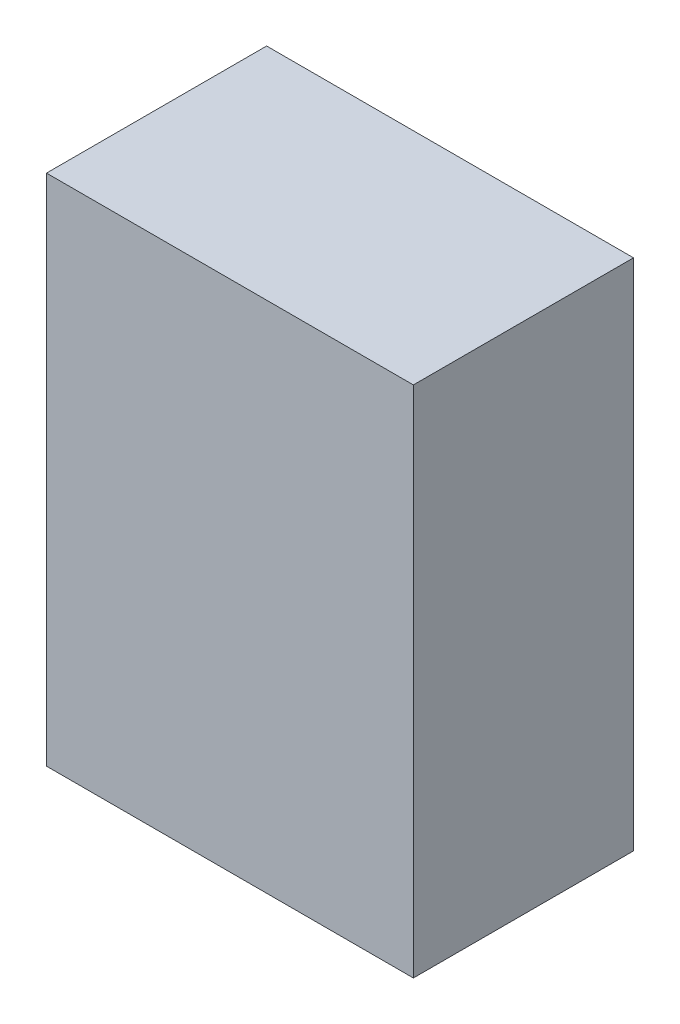
ISO-10303-21;
HEADER;
FILE_DESCRIPTION(('STEP AP214'),'2;1');
FILE_NAME('part.step','',(''),(''),'','','');
FILE_SCHEMA(('AUTOMOTIVE_DESIGN { 1 0 10303 214 1 1 1 1 }'));
ENDSEC;
DATA;
#1=APPLICATION_CONTEXT('core data for automotive mechanical design processes');
#2=APPLICATION_PROTOCOL_DEFINITION('international standard','automotive_design',2000,#1);
#3=PRODUCT_CONTEXT('',#1,'mechanical');
#4=PRODUCT('Part','Part','',(#3));
#5=PRODUCT_RELATED_PRODUCT_CATEGORY('part','',(#4));
#6=PRODUCT_DEFINITION_FORMATION('','',#4);
#7=PRODUCT_DEFINITION_CONTEXT('part definition',#1,'design');
#8=PRODUCT_DEFINITION('design','',#6,#7);
#9=PRODUCT_DEFINITION_SHAPE('','',#8);
#10=(LENGTH_UNIT() NAMED_UNIT(*) SI_UNIT(.MILLI.,.METRE.));
#11=(NAMED_UNIT(*) PLANE_ANGLE_UNIT() SI_UNIT($,.RADIAN.));
#12=(NAMED_UNIT(*) SI_UNIT($,.STERADIAN.) SOLID_ANGLE_UNIT());
#13=UNCERTAINTY_MEASURE_WITH_UNIT(LENGTH_MEASURE(1.E-05),#10,'distance_accuracy_value','');
#14=(GEOMETRIC_REPRESENTATION_CONTEXT(3) GLOBAL_UNCERTAINTY_ASSIGNED_CONTEXT((#13)) GLOBAL_UNIT_ASSIGNED_CONTEXT((#10,
#11,#12)) REPRESENTATION_CONTEXT('',''));
#15=CARTESIAN_POINT('',(0.,0.,0.));
#16=DIRECTION('',(0.,0.,1.));
#17=DIRECTION('',(1.,0.,0.));
#18=AXIS2_PLACEMENT_3D('',#15,#16,#17);
#19=CARTESIAN_POINT('',(0.,0.,30.));
#20=DIRECTION('',(0.,1.,0.));
#21=DIRECTION('',(0.,0.,1.));
#22=AXIS2_PLACEMENT_3D('',#19,#20,#21);
#23=PLANE('',#22);
#24=DIRECTION('',(1.,0.,0.));
#25=VECTOR('',#24,1.);
#26=CARTESIAN_POINT('',(0.,0.,0.));
#27=LINE('',#26,#25);
#28=CARTESIAN_POINT('',(-50.,0.,0.));
#29=VERTEX_POINT('',#28);
#30=CARTESIAN_POINT('',(0.,0.,0.));
#31=VERTEX_POINT('',#30);
#32=EDGE_CURVE('E102',#29,#31,#27,.T.);
#33=ORIENTED_EDGE('',*,*,#32,.T.);
#34=DIRECTION('',(0.,0.,-1.));
#35=VECTOR('',#34,1.);
#36=CARTESIAN_POINT('',(0.,0.,30.));
#37=LINE('',#36,#35);
#38=CARTESIAN_POINT('',(0.,0.,30.));
#39=VERTEX_POINT('',#38);
#40=EDGE_CURVE('E11',#39,#31,#37,.T.);
#41=ORIENTED_EDGE('',*,*,#40,.F.);
#42=DIRECTION('',(1.,0.,0.));
#43=VECTOR('',#42,1.);
#44=CARTESIAN_POINT('',(0.,0.,30.));
#45=LINE('',#44,#43);
#46=CARTESIAN_POINT('',(-50.,0.,30.));
#47=VERTEX_POINT('',#46);
#48=EDGE_CURVE('E90',#47,#39,#45,.T.);
#49=ORIENTED_EDGE('',*,*,#48,.F.);
#50=DIRECTION('',(0.,0.,-1.));
#51=VECTOR('',#50,1.);
#52=CARTESIAN_POINT('',(-50.,0.,30.));
#53=LINE('',#52,#51);
#54=EDGE_CURVE('E98',#47,#29,#53,.T.);
#55=ORIENTED_EDGE('',*,*,#54,.T.);
#56=EDGE_LOOP('',(#33,#41,#49,#55));
#57=FACE_BOUND('',#56,.T.);
#58=ADVANCED_FACE('F39',(#57),#23,.F.);
#59=CARTESIAN_POINT('',(0.,0.,30.));
#60=DIRECTION('',(-1.,0.,0.));
#61=DIRECTION('',(0.,0.,1.));
#62=AXIS2_PLACEMENT_3D('',#59,#60,#61);
#63=PLANE('',#62);
#64=DIRECTION('',(0.,1.,0.));
#65=VECTOR('',#64,1.);
#66=CARTESIAN_POINT('',(0.,0.,0.));
#67=LINE('',#66,#65);
#68=CARTESIAN_POINT('',(0.,70.,0.));
#69=VERTEX_POINT('',#68);
#70=EDGE_CURVE('E94',#31,#69,#67,.T.);
#71=ORIENTED_EDGE('',*,*,#70,.T.);
#72=DIRECTION('',(0.,0.,-1.));
#73=VECTOR('',#72,1.);
#74=CARTESIAN_POINT('',(0.,70.,30.));
#75=LINE('',#74,#73);
#76=CARTESIAN_POINT('',(0.,70.,30.));
#77=VERTEX_POINT('',#76);
#78=EDGE_CURVE('E47',#77,#69,#75,.T.);
#79=ORIENTED_EDGE('',*,*,#78,.F.);
#80=DIRECTION('',(0.,1.,0.));
#81=VECTOR('',#80,1.);
#82=CARTESIAN_POINT('',(0.,0.,30.));
#83=LINE('',#82,#81);
#84=EDGE_CURVE('E85',#39,#77,#83,.T.);
#85=ORIENTED_EDGE('',*,*,#84,.F.);
#86=ORIENTED_EDGE('',*,*,#40,.T.);
#87=EDGE_LOOP('',(#71,#79,#85,#86));
#88=FACE_BOUND('',#87,.T.);
#89=ADVANCED_FACE('F93',(#88),#63,.F.);
#90=CARTESIAN_POINT('',(0.,70.,30.));
#91=DIRECTION('',(0.,-1.,0.));
#92=DIRECTION('',(0.,0.,-1.));
#93=AXIS2_PLACEMENT_3D('',#90,#91,#92);
#94=PLANE('',#93);
#95=DIRECTION('',(-1.,0.,0.));
#96=VECTOR('',#95,1.);
#97=CARTESIAN_POINT('',(0.,70.,0.));
#98=LINE('',#97,#96);
#99=CARTESIAN_POINT('',(-50.,70.,0.));
#100=VERTEX_POINT('',#99);
#101=EDGE_CURVE('E72',#69,#100,#98,.T.);
#102=ORIENTED_EDGE('',*,*,#101,.T.);
#103=DIRECTION('',(0.,0.,-1.));
#104=VECTOR('',#103,1.);
#105=CARTESIAN_POINT('',(-50.,70.,30.));
#106=LINE('',#105,#104);
#107=CARTESIAN_POINT('',(-50.,70.,30.));
#108=VERTEX_POINT('',#107);
#109=EDGE_CURVE('E95',#108,#100,#106,.T.);
#110=ORIENTED_EDGE('',*,*,#109,.F.);
#111=DIRECTION('',(-1.,0.,0.));
#112=VECTOR('',#111,1.);
#113=CARTESIAN_POINT('',(0.,70.,30.));
#114=LINE('',#113,#112);
#115=EDGE_CURVE('E88',#77,#108,#114,.T.);
#116=ORIENTED_EDGE('',*,*,#115,.F.);
#117=ORIENTED_EDGE('',*,*,#78,.T.);
#118=EDGE_LOOP('',(#102,#110,#116,#117));
#119=FACE_BOUND('',#118,.T.);
#120=ADVANCED_FACE('F96',(#119),#94,.F.);
#121=CARTESIAN_POINT('',(-50.,0.,30.));
#122=DIRECTION('',(1.,0.,0.));
#123=DIRECTION('',(0.,0.,-1.));
#124=AXIS2_PLACEMENT_3D('',#121,#122,#123);
#125=PLANE('',#124);
#126=DIRECTION('',(0.,-1.,0.));
#127=VECTOR('',#126,1.);
#128=CARTESIAN_POINT('',(-50.,0.,0.));
#129=LINE('',#128,#127);
#130=EDGE_CURVE('E78',#100,#29,#129,.T.);
#131=ORIENTED_EDGE('',*,*,#130,.T.);
#132=ORIENTED_EDGE('',*,*,#54,.F.);
#133=DIRECTION('',(0.,-1.,0.));
#134=VECTOR('',#133,1.);
#135=CARTESIAN_POINT('',(-50.,0.,30.));
#136=LINE('',#135,#134);
#137=EDGE_CURVE('E55',#108,#47,#136,.T.);
#138=ORIENTED_EDGE('',*,*,#137,.F.);
#139=ORIENTED_EDGE('',*,*,#109,.T.);
#140=EDGE_LOOP('',(#131,#132,#138,#139));
#141=FACE_BOUND('',#140,.T.);
#142=ADVANCED_FACE('F109',(#141),#125,.F.);
#143=CARTESIAN_POINT('',(0.,0.,30.));
#144=DIRECTION('',(0.,0.,-1.));
#145=DIRECTION('',(-1.,0.,0.));
#146=AXIS2_PLACEMENT_3D('',#143,#144,#145);
#147=PLANE('',#146);
#148=ORIENTED_EDGE('',*,*,#48,.T.);
#149=ORIENTED_EDGE('',*,*,#84,.T.);
#150=ORIENTED_EDGE('',*,*,#115,.T.);
#151=ORIENTED_EDGE('',*,*,#137,.T.);
#152=EDGE_LOOP('',(#148,#149,#150,#151));
#153=FACE_BOUND('',#152,.T.);
#154=ADVANCED_FACE('F86',(#153),#147,.F.);
#155=CARTESIAN_POINT('',(0.,0.,0.));
#156=DIRECTION('',(0.,0.,-1.));
#157=DIRECTION('',(-1.,0.,0.));
#158=AXIS2_PLACEMENT_3D('',#155,#156,#157);
#159=PLANE('',#158);
#160=ORIENTED_EDGE('',*,*,#32,.F.);
#161=ORIENTED_EDGE('',*,*,#130,.F.);
#162=ORIENTED_EDGE('',*,*,#101,.F.);
#163=ORIENTED_EDGE('',*,*,#70,.F.);
#164=EDGE_LOOP('',(#160,#161,#162,#163));
#165=FACE_BOUND('',#164,.T.);
#166=ADVANCED_FACE('F112',(#165),#159,.T.);
#167=CLOSED_SHELL('',(#58,#89,#120,#142,#154,#166));
#168=MANIFOLD_SOLID_BREP('B2',#167);
#169=ADVANCED_BREP_SHAPE_REPRESENTATION('',(#18,#168),#14);
#170=SHAPE_DEFINITION_REPRESENTATION(#9,#169);
ENDSEC;
END-ISO-10303-21;
